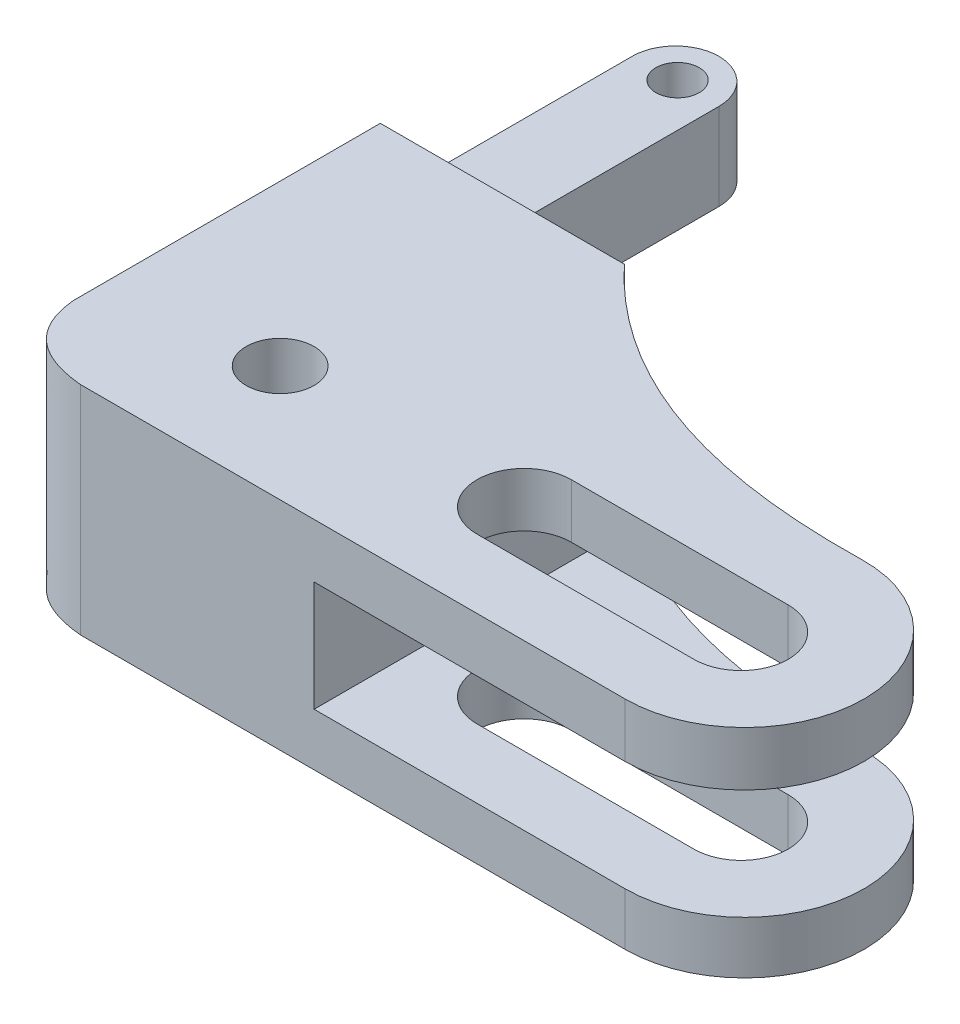
ISO-10303-21;
HEADER;
FILE_DESCRIPTION(('STEP AP214'),'2;1');
FILE_NAME('part.step','',(''),(''),'','','');
FILE_SCHEMA(('AUTOMOTIVE_DESIGN { 1 0 10303 214 1 1 1 1 }'));
ENDSEC;
DATA;
#1=APPLICATION_CONTEXT('core data for automotive mechanical design processes');
#2=APPLICATION_PROTOCOL_DEFINITION('international standard','automotive_design',2000,#1);
#3=PRODUCT_CONTEXT('',#1,'mechanical');
#4=PRODUCT('Part','Part','',(#3));
#5=PRODUCT_RELATED_PRODUCT_CATEGORY('part','',(#4));
#6=PRODUCT_DEFINITION_FORMATION('','',#4);
#7=PRODUCT_DEFINITION_CONTEXT('part definition',#1,'design');
#8=PRODUCT_DEFINITION('design','',#6,#7);
#9=PRODUCT_DEFINITION_SHAPE('','',#8);
#10=(LENGTH_UNIT() NAMED_UNIT(*) SI_UNIT(.MILLI.,.METRE.));
#11=(NAMED_UNIT(*) PLANE_ANGLE_UNIT() SI_UNIT($,.RADIAN.));
#12=(NAMED_UNIT(*) SI_UNIT($,.STERADIAN.) SOLID_ANGLE_UNIT());
#13=UNCERTAINTY_MEASURE_WITH_UNIT(LENGTH_MEASURE(1.E-05),#10,'distance_accuracy_value','');
#14=(GEOMETRIC_REPRESENTATION_CONTEXT(3) GLOBAL_UNCERTAINTY_ASSIGNED_CONTEXT((#13)) GLOBAL_UNIT_ASSIGNED_CONTEXT((#10,
#11,#12)) REPRESENTATION_CONTEXT('',''));
#15=CARTESIAN_POINT('',(0.,0.,0.));
#16=DIRECTION('',(0.,0.,1.));
#17=DIRECTION('',(1.,0.,0.));
#18=AXIS2_PLACEMENT_3D('',#15,#16,#17);
#19=CARTESIAN_POINT('',(-29.,27.4792545285037,-55.));
#20=DIRECTION('',(-1.,0.,0.));
#21=DIRECTION('',(0.,0.,1.));
#22=AXIS2_PLACEMENT_3D('',#19,#20,#21);
#23=PLANE('',#22);
#24=DIRECTION('',(0.,1.,0.));
#25=VECTOR('',#24,1.);
#26=CARTESIAN_POINT('',(-29.,-32.6007454714963,-46.4389445428292));
#27=LINE('',#26,#25);
#28=CARTESIAN_POINT('',(-29.,11.4792545285037,-46.4389445428292));
#29=VERTEX_POINT('',#28);
#30=CARTESIAN_POINT('',(-29.,27.4792545285037,-46.4389445428292));
#31=VERTEX_POINT('',#30);
#32=EDGE_CURVE('E54',#29,#31,#27,.T.);
#33=ORIENTED_EDGE('',*,*,#32,.T.);
#34=DIRECTION('',(0.,0.,1.));
#35=VECTOR('',#34,1.);
#36=CARTESIAN_POINT('',(-29.,27.4792545285037,-55.));
#37=LINE('',#36,#35);
#38=CARTESIAN_POINT('',(-29.,27.4792545285037,0.));
#39=VERTEX_POINT('',#38);
#40=EDGE_CURVE('E196',#31,#39,#37,.T.);
#41=ORIENTED_EDGE('',*,*,#40,.T.);
#42=DIRECTION('',(0.,-1.,0.));
#43=VECTOR('',#42,1.);
#44=CARTESIAN_POINT('',(-29.,27.4792545285037,0.));
#45=LINE('',#44,#43);
#46=CARTESIAN_POINT('',(-29.,11.4792545285037,0.));
#47=VERTEX_POINT('',#46);
#48=EDGE_CURVE('E401',#39,#47,#45,.T.);
#49=ORIENTED_EDGE('',*,*,#48,.T.);
#50=DIRECTION('',(0.,0.,1.));
#51=VECTOR('',#50,1.);
#52=CARTESIAN_POINT('',(-29.,11.4792545285037,-55.));
#53=LINE('',#52,#51);
#54=EDGE_CURVE('E198',#29,#47,#53,.T.);
#55=ORIENTED_EDGE('',*,*,#54,.F.);
#56=EDGE_LOOP('',(#33,#41,#49,#55));
#57=FACE_BOUND('',#56,.T.);
#58=ADVANCED_FACE('F38',(#57),#23,.F.);
#59=CARTESIAN_POINT('',(69.5078731609222,40.,47.3289069751449));
#60=DIRECTION('',(0.,-1.,0.));
#61=DIRECTION('',(0.,0.,-1.));
#62=AXIS2_PLACEMENT_3D('',#59,#60,#61);
#63=CYLINDRICAL_SURFACE('',#62,22.0423984857294);
#64=DIRECTION('',(0.,-1.,0.));
#65=VECTOR('',#64,1.);
#66=CARTESIAN_POINT('',(69.5078731609222,40.,69.3713054608743));
#67=LINE('',#66,#65);
#68=CARTESIAN_POINT('',(69.5078731609222,40.,69.3713054608743));
#69=VERTEX_POINT('',#68);
#70=CARTESIAN_POINT('',(69.5078731609222,30.010232124605,69.3713054608743));
#71=VERTEX_POINT('',#70);
#72=EDGE_CURVE('E336',#69,#71,#67,.T.);
#73=ORIENTED_EDGE('',*,*,#72,.T.);
#74=CARTESIAN_POINT('',(69.5078731609222,30.010232124605,47.3289069751449));
#75=DIRECTION('',(0.,1.,0.));
#76=DIRECTION('',(0.,0.,1.));
#77=AXIS2_PLACEMENT_3D('',#74,#75,#76);
#78=CIRCLE('',#77,22.0423984857294);
#79=CARTESIAN_POINT('',(69.0559863600929,30.010232124605,25.2911409966497));
#80=VERTEX_POINT('',#79);
#81=EDGE_CURVE('E395',#71,#80,#78,.T.);
#82=ORIENTED_EDGE('',*,*,#81,.T.);
#83=DIRECTION('',(0.,-1.,0.));
#84=VECTOR('',#83,1.);
#85=CARTESIAN_POINT('',(69.0559863600929,40.,25.2911409966497));
#86=LINE('',#85,#84);
#87=CARTESIAN_POINT('',(69.0559863600929,40.,25.2911409966497));
#88=VERTEX_POINT('',#87);
#89=EDGE_CURVE('E332',#88,#80,#86,.T.);
#90=ORIENTED_EDGE('',*,*,#89,.F.);
#91=CARTESIAN_POINT('',(69.5078731609222,40.,47.3289069751449));
#92=DIRECTION('',(0.,1.,0.));
#93=DIRECTION('',(0.,0.,-1.));
#94=AXIS2_PLACEMENT_3D('',#91,#92,#93);
#95=CIRCLE('',#94,22.0423984857294);
#96=EDGE_CURVE('E295',#69,#88,#95,.T.);
#97=ORIENTED_EDGE('',*,*,#96,.F.);
#98=EDGE_LOOP('',(#73,#82,#90,#97));
#99=FACE_BOUND('',#98,.T.);
#100=ADVANCED_FACE('F281',(#99),#63,.T.);
#101=CARTESIAN_POINT('',(29.521633996769,40.,48.));
#102=DIRECTION('',(0.,-1.,0.));
#103=DIRECTION('',(0.,0.,-1.));
#104=AXIS2_PLACEMENT_3D('',#101,#102,#103);
#105=CYLINDRICAL_SURFACE('',#104,8.69568045494646);
#106=CARTESIAN_POINT('',(29.521633996769,30.010232124605,48.));
#107=DIRECTION('',(0.,1.,0.));
#108=DIRECTION('',(0.,0.,1.));
#109=AXIS2_PLACEMENT_3D('',#106,#107,#108);
#110=CIRCLE('',#109,8.69568045494646);
#111=CARTESIAN_POINT('',(29.521633996769,30.010232124605,39.3043195450535));
#112=VERTEX_POINT('',#111);
#113=CARTESIAN_POINT('',(29.521633996769,30.010232124605,56.6956804549465));
#114=VERTEX_POINT('',#113);
#115=EDGE_CURVE('E390',#112,#114,#110,.T.);
#116=ORIENTED_EDGE('',*,*,#115,.F.);
#117=DIRECTION('',(0.,-1.,0.));
#118=VECTOR('',#117,1.);
#119=CARTESIAN_POINT('',(29.521633996769,40.,39.3043195450535));
#120=LINE('',#119,#118);
#121=CARTESIAN_POINT('',(29.521633996769,40.,39.3043195450535));
#122=VERTEX_POINT('',#121);
#123=EDGE_CURVE('E239',#122,#112,#120,.T.);
#124=ORIENTED_EDGE('',*,*,#123,.F.);
#125=CARTESIAN_POINT('',(29.521633996769,40.,48.));
#126=DIRECTION('',(0.,1.,0.));
#127=DIRECTION('',(0.,0.,1.));
#128=AXIS2_PLACEMENT_3D('',#125,#126,#127);
#129=CIRCLE('',#128,8.69568045494646);
#130=CARTESIAN_POINT('',(29.521633996769,40.,56.6956804549465));
#131=VERTEX_POINT('',#130);
#132=EDGE_CURVE('E218',#122,#131,#129,.T.);
#133=ORIENTED_EDGE('',*,*,#132,.T.);
#134=DIRECTION('',(0.,-1.,0.));
#135=VECTOR('',#134,1.);
#136=CARTESIAN_POINT('',(29.521633996769,40.,56.6956804549465));
#137=LINE('',#136,#135);
#138=EDGE_CURVE('E251',#131,#114,#137,.T.);
#139=ORIENTED_EDGE('',*,*,#138,.T.);
#140=EDGE_LOOP('',(#116,#124,#133,#139));
#141=FACE_BOUND('',#140,.T.);
#142=ADVANCED_FACE('F434',(#141),#105,.F.);
#143=CARTESIAN_POINT('',(29.521633996769,40.,56.6956804549465));
#144=DIRECTION('',(0.,0.,-1.));
#145=DIRECTION('',(-1.,0.,0.));
#146=AXIS2_PLACEMENT_3D('',#143,#144,#145);
#147=PLANE('',#146);
#148=DIRECTION('',(1.,0.,0.));
#149=VECTOR('',#148,1.);
#150=CARTESIAN_POINT('',(29.521633996769,30.010232124605,56.6956804549465));
#151=LINE('',#150,#149);
#152=CARTESIAN_POINT('',(69.521633996769,30.010232124605,56.6956804549465));
#153=VERTEX_POINT('',#152);
#154=EDGE_CURVE('E388',#114,#153,#151,.T.);
#155=ORIENTED_EDGE('',*,*,#154,.F.);
#156=ORIENTED_EDGE('',*,*,#138,.F.);
#157=DIRECTION('',(1.,0.,0.));
#158=VECTOR('',#157,1.);
#159=CARTESIAN_POINT('',(29.521633996769,40.,56.6956804549465));
#160=LINE('',#159,#158);
#161=CARTESIAN_POINT('',(69.521633996769,40.,56.6956804549465));
#162=VERTEX_POINT('',#161);
#163=EDGE_CURVE('E220',#131,#162,#160,.T.);
#164=ORIENTED_EDGE('',*,*,#163,.T.);
#165=DIRECTION('',(0.,-1.,0.));
#166=VECTOR('',#165,1.);
#167=CARTESIAN_POINT('',(69.521633996769,40.,56.6956804549465));
#168=LINE('',#167,#166);
#169=EDGE_CURVE('E247',#162,#153,#168,.T.);
#170=ORIENTED_EDGE('',*,*,#169,.T.);
#171=EDGE_LOOP('',(#155,#156,#164,#170));
#172=FACE_BOUND('',#171,.T.);
#173=ADVANCED_FACE('F454',(#172),#147,.T.);
#174=CARTESIAN_POINT('',(69.521633996769,40.,48.));
#175=DIRECTION('',(0.,-1.,0.));
#176=DIRECTION('',(0.,0.,-1.));
#177=AXIS2_PLACEMENT_3D('',#174,#175,#176);
#178=CYLINDRICAL_SURFACE('',#177,8.69568045494646);
#179=CARTESIAN_POINT('',(69.521633996769,30.010232124605,48.));
#180=DIRECTION('',(0.,1.,0.));
#181=DIRECTION('',(0.,0.,1.));
#182=AXIS2_PLACEMENT_3D('',#179,#180,#181);
#183=CIRCLE('',#182,8.69568045494646);
#184=CARTESIAN_POINT('',(69.521633996769,30.010232124605,39.3043195450535));
#185=VERTEX_POINT('',#184);
#186=EDGE_CURVE('E386',#153,#185,#183,.T.);
#187=ORIENTED_EDGE('',*,*,#186,.F.);
#188=ORIENTED_EDGE('',*,*,#169,.F.);
#189=CARTESIAN_POINT('',(69.521633996769,40.,48.));
#190=DIRECTION('',(0.,1.,0.));
#191=DIRECTION('',(0.,0.,1.));
#192=AXIS2_PLACEMENT_3D('',#189,#190,#191);
#193=CIRCLE('',#192,8.69568045494646);
#194=CARTESIAN_POINT('',(69.521633996769,40.,39.3043195450535));
#195=VERTEX_POINT('',#194);
#196=EDGE_CURVE('E223',#162,#195,#193,.T.);
#197=ORIENTED_EDGE('',*,*,#196,.T.);
#198=DIRECTION('',(0.,-1.,0.));
#199=VECTOR('',#198,1.);
#200=CARTESIAN_POINT('',(69.521633996769,40.,39.3043195450535));
#201=LINE('',#200,#199);
#202=EDGE_CURVE('E243',#195,#185,#201,.T.);
#203=ORIENTED_EDGE('',*,*,#202,.T.);
#204=EDGE_LOOP('',(#187,#188,#197,#203));
#205=FACE_BOUND('',#204,.T.);
#206=ADVANCED_FACE('F450',(#205),#178,.F.);
#207=CARTESIAN_POINT('',(29.521633996769,40.,39.3043195450535));
#208=DIRECTION('',(0.,0.,1.));
#209=DIRECTION('',(1.,0.,0.));
#210=AXIS2_PLACEMENT_3D('',#207,#208,#209);
#211=PLANE('',#210);
#212=DIRECTION('',(-1.,0.,0.));
#213=VECTOR('',#212,1.);
#214=CARTESIAN_POINT('',(29.521633996769,30.010232124605,39.3043195450535));
#215=LINE('',#214,#213);
#216=EDGE_CURVE('E347',#185,#112,#215,.T.);
#217=ORIENTED_EDGE('',*,*,#216,.F.);
#218=ORIENTED_EDGE('',*,*,#202,.F.);
#219=DIRECTION('',(-1.,0.,0.));
#220=VECTOR('',#219,1.);
#221=CARTESIAN_POINT('',(29.521633996769,40.,39.3043195450535));
#222=LINE('',#221,#220);
#223=EDGE_CURVE('E226',#195,#122,#222,.T.);
#224=ORIENTED_EDGE('',*,*,#223,.T.);
#225=ORIENTED_EDGE('',*,*,#123,.T.);
#226=EDGE_LOOP('',(#217,#218,#224,#225));
#227=FACE_BOUND('',#226,.T.);
#228=ADVANCED_FACE('F445',(#227),#211,.T.);
#229=CARTESIAN_POINT('',(-45.,40.,0.));
#230=DIRECTION('',(0.,0.,1.));
#231=DIRECTION('',(1.,0.,0.));
#232=AXIS2_PLACEMENT_3D('',#229,#230,#231);
#233=PLANE('',#232);
#234=DIRECTION('',(1.,0.,0.));
#235=VECTOR('',#234,1.);
#236=CARTESIAN_POINT('',(-45.,27.4792545285037,0.));
#237=LINE('',#236,#235);
#238=CARTESIAN_POINT('',(-45.,27.4792545285037,0.));
#239=VERTEX_POINT('',#238);
#240=EDGE_CURVE('E203',#239,#39,#237,.T.);
#241=ORIENTED_EDGE('',*,*,#240,.F.);
#242=DIRECTION('',(0.,-1.,0.));
#243=VECTOR('',#242,1.);
#244=CARTESIAN_POINT('',(-45.,40.,0.));
#245=LINE('',#244,#243);
#246=CARTESIAN_POINT('',(-45.,40.,0.));
#247=VERTEX_POINT('',#246);
#248=EDGE_CURVE('E325',#247,#239,#245,.T.);
#249=ORIENTED_EDGE('',*,*,#248,.F.);
#250=DIRECTION('',(-1.,0.,0.));
#251=VECTOR('',#250,1.);
#252=CARTESIAN_POINT('',(-45.,40.,0.));
#253=LINE('',#252,#251);
#254=CARTESIAN_POINT('',(0.,40.,0.));
#255=VERTEX_POINT('',#254);
#256=EDGE_CURVE('E294',#255,#247,#253,.T.);
#257=ORIENTED_EDGE('',*,*,#256,.F.);
#258=DIRECTION('',(0.,-1.,0.));
#259=VECTOR('',#258,1.);
#260=CARTESIAN_POINT('',(0.,40.,0.));
#261=LINE('',#260,#259);
#262=CARTESIAN_POINT('',(0.,0.,0.));
#263=VERTEX_POINT('',#262);
#264=EDGE_CURVE('E328',#255,#263,#261,.T.);
#265=ORIENTED_EDGE('',*,*,#264,.T.);
#266=DIRECTION('',(-1.,0.,0.));
#267=VECTOR('',#266,1.);
#268=CARTESIAN_POINT('',(-45.,0.,0.));
#269=LINE('',#268,#267);
#270=CARTESIAN_POINT('',(-45.,0.,0.));
#271=VERTEX_POINT('',#270);
#272=EDGE_CURVE('E258',#263,#271,#269,.T.);
#273=ORIENTED_EDGE('',*,*,#272,.T.);
#274=CARTESIAN_POINT('',(-45.,11.4792545285037,0.));
#275=VERTEX_POINT('',#274);
#276=EDGE_CURVE('E300',#275,#271,#245,.T.);
#277=ORIENTED_EDGE('',*,*,#276,.F.);
#278=DIRECTION('',(-1.,0.,0.));
#279=VECTOR('',#278,1.);
#280=CARTESIAN_POINT('',(-29.,11.4792545285037,0.));
#281=LINE('',#280,#279);
#282=EDGE_CURVE('E403',#47,#275,#281,.T.);
#283=ORIENTED_EDGE('',*,*,#282,.F.);
#284=ORIENTED_EDGE('',*,*,#48,.F.);
#285=EDGE_LOOP('',(#241,#249,#257,#265,#273,#277,#283,#284));
#286=FACE_BOUND('',#285,.T.);
#287=ADVANCED_FACE('F287',(#286),#233,.F.);
#288=CARTESIAN_POINT('',(-40.9290697802702,40.,65.6332777297204));
#289=DIRECTION('',(0.,-1.,0.));
#290=DIRECTION('',(0.,0.,-1.));
#291=AXIS2_PLACEMENT_3D('',#288,#289,#290);
#292=PLANE('',#291);
#293=DIRECTION('',(0.,0.,1.));
#294=VECTOR('',#293,1.);
#295=CARTESIAN_POINT('',(-45.,40.,0.));
#296=LINE('',#295,#294);
#297=CARTESIAN_POINT('',(-45.,40.,56.6956804549465));
#298=VERTEX_POINT('',#297);
#299=EDGE_CURVE('E255',#247,#298,#296,.T.);
#300=ORIENTED_EDGE('',*,*,#299,.T.);
#301=CARTESIAN_POINT('',(-45.,40.,56.6956804549465));
#302=CARTESIAN_POINT('',(-43.8987593024814,40.,68.2330625015305));
#303=CARTESIAN_POINT('',(-30.918760516118,40.,69.3713054608743));
#304=B_SPLINE_CURVE_WITH_KNOTS('',2,(#301,#302,#303),.UNSPECIFIED.,.F.,.F.,(3,3),(0.,1.),.UNSPECIFIED.);
#305=CARTESIAN_POINT('',(-30.918760516118,40.,69.3713054608743));
#306=VERTEX_POINT('',#305);
#307=EDGE_CURVE('E257',#298,#306,#304,.T.);
#308=ORIENTED_EDGE('',*,*,#307,.T.);
#309=DIRECTION('',(1.,0.,0.));
#310=VECTOR('',#309,1.);
#311=CARTESIAN_POINT('',(-30.918760516118,40.,69.3713054608743));
#312=LINE('',#311,#310);
#313=EDGE_CURVE('E263',#306,#69,#312,.T.);
#314=ORIENTED_EDGE('',*,*,#313,.T.);
#315=ORIENTED_EDGE('',*,*,#96,.T.);
#316=CARTESIAN_POINT('',(69.0559863600929,40.,25.2911409966497));
#317=CARTESIAN_POINT('',(40.5073263394192,40.,25.8765343916652));
#318=CARTESIAN_POINT('',(17.3659830879704,40.,18.5560622347472));
#319=CARTESIAN_POINT('',(0.,40.,0.));
#320=B_SPLINE_CURVE_WITH_KNOTS('',3,(#316,#317,#318,#319),.UNSPECIFIED.,.F.,.F.,(4,4),(0.,1.),.UNSPECIFIED.);
#321=EDGE_CURVE('E289',#88,#255,#320,.T.);
#322=ORIENTED_EDGE('',*,*,#321,.T.);
#323=ORIENTED_EDGE('',*,*,#256,.T.);
#324=EDGE_LOOP('',(#300,#308,#314,#315,#322,#323));
#325=FACE_BOUND('',#324,.T.);
#326=ORIENTED_EDGE('',*,*,#132,.F.);
#327=ORIENTED_EDGE('',*,*,#223,.F.);
#328=ORIENTED_EDGE('',*,*,#196,.F.);
#329=ORIENTED_EDGE('',*,*,#163,.F.);
#330=EDGE_LOOP('',(#326,#327,#328,#329));
#331=FACE_BOUND('',#330,.T.);
#332=CARTESIAN_POINT('',(-15.478366003231,40.,48.));
#333=DIRECTION('',(0.,1.,0.));
#334=DIRECTION('',(0.,0.,1.));
#335=AXIS2_PLACEMENT_3D('',#332,#333,#334);
#336=CIRCLE('',#335,6.25);
#337=CARTESIAN_POINT('',(-15.478366003231,40.,54.25));
#338=VERTEX_POINT('',#337);
#339=EDGE_CURVE('E212',#338,#338,#336,.T.);
#340=ORIENTED_EDGE('',*,*,#339,.F.);
#341=EDGE_LOOP('',(#340));
#342=FACE_BOUND('',#341,.T.);
#343=ADVANCED_FACE('F458',(#325,#331,#342),#292,.F.);
#344=CARTESIAN_POINT('',(-40.9290697802702,0.,65.6332777297204));
#345=DIRECTION('',(0.,-1.,0.));
#346=DIRECTION('',(0.,0.,-1.));
#347=AXIS2_PLACEMENT_3D('',#344,#345,#346);
#348=PLANE('',#347);
#349=DIRECTION('',(-1.,0.,0.));
#350=VECTOR('',#349,1.);
#351=CARTESIAN_POINT('',(29.521633996769,0.,39.3043195450535));
#352=LINE('',#351,#350);
#353=CARTESIAN_POINT('',(69.521633996769,0.,39.3043195450535));
#354=VERTEX_POINT('',#353);
#355=CARTESIAN_POINT('',(29.521633996769,0.,39.3043195450535));
#356=VERTEX_POINT('',#355);
#357=EDGE_CURVE('E221',#354,#356,#352,.T.);
#358=ORIENTED_EDGE('',*,*,#357,.T.);
#359=CARTESIAN_POINT('',(29.521633996769,0.,48.));
#360=DIRECTION('',(0.,1.,0.));
#361=DIRECTION('',(0.,0.,1.));
#362=AXIS2_PLACEMENT_3D('',#359,#360,#361);
#363=CIRCLE('',#362,8.69568045494646);
#364=CARTESIAN_POINT('',(29.521633996769,0.,56.6956804549465));
#365=VERTEX_POINT('',#364);
#366=EDGE_CURVE('E215',#356,#365,#363,.T.);
#367=ORIENTED_EDGE('',*,*,#366,.T.);
#368=DIRECTION('',(1.,0.,0.));
#369=VECTOR('',#368,1.);
#370=CARTESIAN_POINT('',(29.521633996769,0.,56.6956804549465));
#371=LINE('',#370,#369);
#372=CARTESIAN_POINT('',(69.521633996769,0.,56.6956804549465));
#373=VERTEX_POINT('',#372);
#374=EDGE_CURVE('E231',#365,#373,#371,.T.);
#375=ORIENTED_EDGE('',*,*,#374,.T.);
#376=CARTESIAN_POINT('',(69.521633996769,0.,48.));
#377=DIRECTION('',(0.,1.,0.));
#378=DIRECTION('',(0.,0.,1.));
#379=AXIS2_PLACEMENT_3D('',#376,#377,#378);
#380=CIRCLE('',#379,8.69568045494646);
#381=EDGE_CURVE('E234',#373,#354,#380,.T.);
#382=ORIENTED_EDGE('',*,*,#381,.T.);
#383=EDGE_LOOP('',(#358,#367,#375,#382));
#384=FACE_BOUND('',#383,.T.);
#385=DIRECTION('',(0.,0.,1.));
#386=VECTOR('',#385,1.);
#387=CARTESIAN_POINT('',(-45.,0.,56.6956804549465));
#388=LINE('',#387,#386);
#389=CARTESIAN_POINT('',(-45.,0.,56.6956804549465));
#390=VERTEX_POINT('',#389);
#391=EDGE_CURVE('E254',#271,#390,#388,.T.);
#392=ORIENTED_EDGE('',*,*,#391,.F.);
#393=ORIENTED_EDGE('',*,*,#272,.F.);
#394=CARTESIAN_POINT('',(69.0559863600929,0.,25.2911409966497));
#395=CARTESIAN_POINT('',(40.5073263394192,0.,25.8765343916652));
#396=CARTESIAN_POINT('',(17.3659830879704,0.,18.5560622347472));
#397=CARTESIAN_POINT('',(0.,0.,0.));
#398=B_SPLINE_CURVE_WITH_KNOTS('',3,(#394,#395,#396,#397),.UNSPECIFIED.,.F.,.F.,(4,4),(0.,1.),.UNSPECIFIED.);
#399=CARTESIAN_POINT('',(69.0559863600929,0.,25.2911409966497));
#400=VERTEX_POINT('',#399);
#401=EDGE_CURVE('E316',#400,#263,#398,.T.);
#402=ORIENTED_EDGE('',*,*,#401,.F.);
#403=CARTESIAN_POINT('',(69.5078731609222,0.,47.3289069751449));
#404=DIRECTION('',(0.,1.,0.));
#405=DIRECTION('',(0.,0.,-1.));
#406=AXIS2_PLACEMENT_3D('',#403,#404,#405);
#407=CIRCLE('',#406,22.0423984857294);
#408=CARTESIAN_POINT('',(69.5078731609222,0.,69.3713054608743));
#409=VERTEX_POINT('',#408);
#410=EDGE_CURVE('E313',#409,#400,#407,.T.);
#411=ORIENTED_EDGE('',*,*,#410,.F.);
#412=DIRECTION('',(1.,0.,0.));
#413=VECTOR('',#412,1.);
#414=CARTESIAN_POINT('',(69.5078731609222,0.,69.3713054608743));
#415=LINE('',#414,#413);
#416=CARTESIAN_POINT('',(-30.918760516118,0.,69.3713054608743));
#417=VERTEX_POINT('',#416);
#418=EDGE_CURVE('E307',#417,#409,#415,.T.);
#419=ORIENTED_EDGE('',*,*,#418,.F.);
#420=CARTESIAN_POINT('',(-45.,0.,56.6956804549465));
#421=CARTESIAN_POINT('',(-43.8987593024814,0.,68.2330625015305));
#422=CARTESIAN_POINT('',(-30.918760516118,0.,69.3713054608743));
#423=B_SPLINE_CURVE_WITH_KNOTS('',2,(#420,#421,#422),.UNSPECIFIED.,.F.,.F.,(3,3),(0.,1.),.UNSPECIFIED.);
#424=EDGE_CURVE('E302',#390,#417,#423,.T.);
#425=ORIENTED_EDGE('',*,*,#424,.F.);
#426=EDGE_LOOP('',(#392,#393,#402,#411,#419,#425));
#427=FACE_BOUND('',#426,.T.);
#428=CARTESIAN_POINT('',(-15.478366003231,0.,48.));
#429=DIRECTION('',(0.,1.,0.));
#430=DIRECTION('',(0.,0.,1.));
#431=AXIS2_PLACEMENT_3D('',#428,#429,#430);
#432=CIRCLE('',#431,6.25);
#433=CARTESIAN_POINT('',(-15.478366003231,0.,54.25));
#434=VERTEX_POINT('',#433);
#435=EDGE_CURVE('E206',#434,#434,#432,.T.);
#436=ORIENTED_EDGE('',*,*,#435,.T.);
#437=EDGE_LOOP('',(#436));
#438=FACE_BOUND('',#437,.T.);
#439=ADVANCED_FACE('F460',(#384,#427,#438),#348,.T.);
#440=CARTESIAN_POINT('',(-45.,40.,56.6956804549465));
#441=DIRECTION('',(1.,0.,0.));
#442=DIRECTION('',(0.,0.,-1.));
#443=AXIS2_PLACEMENT_3D('',#440,#441,#442);
#444=PLANE('',#443);
#445=DIRECTION('',(0.,0.,1.));
#446=VECTOR('',#445,1.);
#447=CARTESIAN_POINT('',(-45.,27.4792545285037,-55.));
#448=LINE('',#447,#446);
#449=CARTESIAN_POINT('',(-45.,27.4792545285037,-46.4389445428292));
#450=VERTEX_POINT('',#449);
#451=EDGE_CURVE('E204',#450,#239,#448,.T.);
#452=ORIENTED_EDGE('',*,*,#451,.F.);
#453=DIRECTION('',(0.,1.,0.));
#454=VECTOR('',#453,1.);
#455=CARTESIAN_POINT('',(-45.,-32.6007454714963,-46.4389445428292));
#456=LINE('',#455,#454);
#457=CARTESIAN_POINT('',(-45.,11.4792545285037,-46.4389445428292));
#458=VERTEX_POINT('',#457);
#459=EDGE_CURVE('E188',#458,#450,#456,.T.);
#460=ORIENTED_EDGE('',*,*,#459,.F.);
#461=DIRECTION('',(0.,0.,1.));
#462=VECTOR('',#461,1.);
#463=CARTESIAN_POINT('',(-45.,11.4792545285037,-55.));
#464=LINE('',#463,#462);
#465=EDGE_CURVE('E208',#458,#275,#464,.T.);
#466=ORIENTED_EDGE('',*,*,#465,.T.);
#467=ORIENTED_EDGE('',*,*,#276,.T.);
#468=ORIENTED_EDGE('',*,*,#391,.T.);
#469=DIRECTION('',(0.,-1.,0.));
#470=VECTOR('',#469,1.);
#471=CARTESIAN_POINT('',(-45.,40.,56.6956804549465));
#472=LINE('',#471,#470);
#473=EDGE_CURVE('E342',#298,#390,#472,.T.);
#474=ORIENTED_EDGE('',*,*,#473,.F.);
#475=ORIENTED_EDGE('',*,*,#299,.F.);
#476=ORIENTED_EDGE('',*,*,#248,.T.);
#477=EDGE_LOOP('',(#452,#460,#466,#467,#468,#474,#475,#476));
#478=FACE_BOUND('',#477,.T.);
#479=ADVANCED_FACE('F40',(#478),#444,.F.);
#480=DIRECTION('',(0.,-1.,0.));
#481=VECTOR('',#480,1.);
#482=SURFACE_OF_LINEAR_EXTRUSION('',#304,#481);
#483=ORIENTED_EDGE('',*,*,#424,.T.);
#484=DIRECTION('',(0.,-1.,0.));
#485=VECTOR('',#484,1.);
#486=CARTESIAN_POINT('',(-30.918760516118,40.,69.3713054608743));
#487=LINE('',#486,#485);
#488=EDGE_CURVE('E339',#306,#417,#487,.T.);
#489=ORIENTED_EDGE('',*,*,#488,.F.);
#490=ORIENTED_EDGE('',*,*,#307,.F.);
#491=ORIENTED_EDGE('',*,*,#473,.T.);
#492=EDGE_LOOP('',(#483,#489,#490,#491));
#493=FACE_BOUND('',#492,.T.);
#494=ADVANCED_FACE('F268',(#493),#482,.F.);
#495=CARTESIAN_POINT('',(69.5078731609222,40.,69.3713054608743));
#496=DIRECTION('',(0.,0.,-1.));
#497=DIRECTION('',(-1.,0.,0.));
#498=AXIS2_PLACEMENT_3D('',#495,#496,#497);
#499=PLANE('',#498);
#500=DIRECTION('',(0.,-1.,0.));
#501=VECTOR('',#500,1.);
#502=CARTESIAN_POINT('',(12.1677941120817,30.010232124605,69.3713054608743));
#503=LINE('',#502,#501);
#504=CARTESIAN_POINT('',(12.1677941120817,30.010232124605,69.3713054608743));
#505=VERTEX_POINT('',#504);
#506=CARTESIAN_POINT('',(12.1677941120817,9.68837667406763,69.3713054608743));
#507=VERTEX_POINT('',#506);
#508=EDGE_CURVE('E489',#505,#507,#503,.T.);
#509=ORIENTED_EDGE('',*,*,#508,.F.);
#510=DIRECTION('',(-1.,0.,0.));
#511=VECTOR('',#510,1.);
#512=CARTESIAN_POINT('',(12.1677941120817,30.010232124605,69.3713054608743));
#513=LINE('',#512,#511);
#514=EDGE_CURVE('E366',#71,#505,#513,.T.);
#515=ORIENTED_EDGE('',*,*,#514,.F.);
#516=ORIENTED_EDGE('',*,*,#72,.F.);
#517=ORIENTED_EDGE('',*,*,#313,.F.);
#518=ORIENTED_EDGE('',*,*,#488,.T.);
#519=ORIENTED_EDGE('',*,*,#418,.T.);
#520=CARTESIAN_POINT('',(69.5078731609222,9.68837667406763,69.3713054608743));
#521=VERTEX_POINT('',#520);
#522=EDGE_CURVE('E335',#521,#409,#67,.T.);
#523=ORIENTED_EDGE('',*,*,#522,.F.);
#524=DIRECTION('',(1.,0.,0.));
#525=VECTOR('',#524,1.);
#526=CARTESIAN_POINT('',(12.1677941120817,9.68837667406763,69.3713054608743));
#527=LINE('',#526,#525);
#528=EDGE_CURVE('E490',#507,#521,#527,.T.);
#529=ORIENTED_EDGE('',*,*,#528,.F.);
#530=EDGE_LOOP('',(#509,#515,#516,#517,#518,#519,#523,#529));
#531=FACE_BOUND('',#530,.T.);
#532=ADVANCED_FACE('F271',(#531),#499,.F.);
#533=CARTESIAN_POINT('',(69.0559863600929,9.68837667406763,25.2911409966497));
#534=VERTEX_POINT('',#533);
#535=EDGE_CURVE('E331',#534,#400,#86,.T.);
#536=ORIENTED_EDGE('',*,*,#535,.F.);
#537=CARTESIAN_POINT('',(69.5078731609222,9.68837667406763,47.3289069751449));
#538=DIRECTION('',(0.,-1.,0.));
#539=DIRECTION('',(0.,0.,-1.));
#540=AXIS2_PLACEMENT_3D('',#537,#538,#539);
#541=CIRCLE('',#540,22.0423984857294);
#542=EDGE_CURVE('E61',#534,#521,#541,.T.);
#543=ORIENTED_EDGE('',*,*,#542,.T.);
#544=ORIENTED_EDGE('',*,*,#522,.T.);
#545=ORIENTED_EDGE('',*,*,#410,.T.);
#546=EDGE_LOOP('',(#536,#543,#544,#545));
#547=FACE_BOUND('',#546,.T.);
#548=ADVANCED_FACE('F275',(#547),#63,.T.);
#549=DIRECTION('',(0.,-1.,0.));
#550=VECTOR('',#549,1.);
#551=SURFACE_OF_LINEAR_EXTRUSION('',#320,#550);
#552=ORIENTED_EDGE('',*,*,#89,.T.);
#553=CARTESIAN_POINT('',(69.0559863600929,30.010232124605,25.2911409966497));
#554=CARTESIAN_POINT('',(40.5073263394192,30.010232124605,25.8765343916652));
#555=CARTESIAN_POINT('',(17.3659830879704,30.010232124605,18.5560622347472));
#556=CARTESIAN_POINT('',(0.,30.010232124605,0.));
#557=B_SPLINE_CURVE_WITH_KNOTS('',3,(#553,#554,#555,#556),.UNSPECIFIED.,.F.,.F.,(4,4),(0.,1.),.UNSPECIFIED.);
#558=CARTESIAN_POINT('',(12.1677941120817,30.010232124605,10.5619164332128));
#559=VERTEX_POINT('',#558);
#560=EDGE_CURVE('E353',#80,#559,#557,.T.);
#561=ORIENTED_EDGE('',*,*,#560,.T.);
#562=DIRECTION('',(0.,-1.,0.));
#563=VECTOR('',#562,1.);
#564=CARTESIAN_POINT('',(12.1677941120817,40.,10.561916438141));
#565=LINE('',#564,#563);
#566=CARTESIAN_POINT('',(12.1677941120817,9.68837667406763,10.5619164332128));
#567=VERTEX_POINT('',#566);
#568=EDGE_CURVE('E47',#559,#567,#565,.T.);
#569=ORIENTED_EDGE('',*,*,#568,.T.);
#570=CARTESIAN_POINT('',(69.0559863600929,9.68837667406763,25.2911409966497));
#571=CARTESIAN_POINT('',(40.5073263394192,9.68837667406763,25.8765343916652));
#572=CARTESIAN_POINT('',(17.3659830879704,9.68837667406763,18.5560622347472));
#573=CARTESIAN_POINT('',(0.,9.68837667406763,0.));
#574=B_SPLINE_CURVE_WITH_KNOTS('',3,(#570,#571,#572,#573),.UNSPECIFIED.,.F.,.F.,(4,4),(0.,1.),.UNSPECIFIED.);
#575=EDGE_CURVE('E351',#567,#534,#574,.F.);
#576=ORIENTED_EDGE('',*,*,#575,.T.);
#577=ORIENTED_EDGE('',*,*,#535,.T.);
#578=ORIENTED_EDGE('',*,*,#401,.T.);
#579=ORIENTED_EDGE('',*,*,#264,.F.);
#580=ORIENTED_EDGE('',*,*,#321,.F.);
#581=EDGE_LOOP('',(#552,#561,#569,#576,#577,#578,#579,#580));
#582=FACE_BOUND('',#581,.T.);
#583=ADVANCED_FACE('F279',(#582),#551,.F.);
#584=CARTESIAN_POINT('',(29.521633996769,9.68837667406763,48.));
#585=DIRECTION('',(0.,-1.,0.));
#586=DIRECTION('',(0.,0.,-1.));
#587=AXIS2_PLACEMENT_3D('',#584,#585,#586);
#588=CIRCLE('',#587,8.69568045494646);
#589=CARTESIAN_POINT('',(29.521633996769,9.68837667406763,56.6956804549465));
#590=VERTEX_POINT('',#589);
#591=CARTESIAN_POINT('',(29.521633996769,9.68837667406763,39.3043195450535));
#592=VERTEX_POINT('',#591);
#593=EDGE_CURVE('E377',#590,#592,#588,.T.);
#594=ORIENTED_EDGE('',*,*,#593,.F.);
#595=EDGE_CURVE('E250',#590,#365,#137,.T.);
#596=ORIENTED_EDGE('',*,*,#595,.T.);
#597=ORIENTED_EDGE('',*,*,#366,.F.);
#598=EDGE_CURVE('E228',#592,#356,#120,.T.);
#599=ORIENTED_EDGE('',*,*,#598,.F.);
#600=EDGE_LOOP('',(#594,#596,#597,#599));
#601=FACE_BOUND('',#600,.T.);
#602=ADVANCED_FACE('F285',(#601),#105,.F.);
#603=DIRECTION('',(-1.,0.,0.));
#604=VECTOR('',#603,1.);
#605=CARTESIAN_POINT('',(29.521633996769,9.68837667406763,56.6956804549465));
#606=LINE('',#605,#604);
#607=CARTESIAN_POINT('',(69.521633996769,9.68837667406763,56.6956804549465));
#608=VERTEX_POINT('',#607);
#609=EDGE_CURVE('E370',#608,#590,#606,.T.);
#610=ORIENTED_EDGE('',*,*,#609,.F.);
#611=EDGE_CURVE('E246',#608,#373,#168,.T.);
#612=ORIENTED_EDGE('',*,*,#611,.T.);
#613=ORIENTED_EDGE('',*,*,#374,.F.);
#614=ORIENTED_EDGE('',*,*,#595,.F.);
#615=EDGE_LOOP('',(#610,#612,#613,#614));
#616=FACE_BOUND('',#615,.T.);
#617=ADVANCED_FACE('F448',(#616),#147,.T.);
#618=CARTESIAN_POINT('',(69.521633996769,9.68837667406763,48.));
#619=DIRECTION('',(0.,-1.,0.));
#620=DIRECTION('',(0.,0.,-1.));
#621=AXIS2_PLACEMENT_3D('',#618,#619,#620);
#622=CIRCLE('',#621,8.69568045494646);
#623=CARTESIAN_POINT('',(69.521633996769,9.68837667406763,39.3043195450535));
#624=VERTEX_POINT('',#623);
#625=EDGE_CURVE('E368',#624,#608,#622,.T.);
#626=ORIENTED_EDGE('',*,*,#625,.F.);
#627=EDGE_CURVE('E242',#624,#354,#201,.T.);
#628=ORIENTED_EDGE('',*,*,#627,.T.);
#629=ORIENTED_EDGE('',*,*,#381,.F.);
#630=ORIENTED_EDGE('',*,*,#611,.F.);
#631=EDGE_LOOP('',(#626,#628,#629,#630));
#632=FACE_BOUND('',#631,.T.);
#633=ADVANCED_FACE('F443',(#632),#178,.F.);
#634=DIRECTION('',(1.,0.,0.));
#635=VECTOR('',#634,1.);
#636=CARTESIAN_POINT('',(29.521633996769,9.68837667406763,39.3043195450535));
#637=LINE('',#636,#635);
#638=EDGE_CURVE('E345',#592,#624,#637,.T.);
#639=ORIENTED_EDGE('',*,*,#638,.F.);
#640=ORIENTED_EDGE('',*,*,#598,.T.);
#641=ORIENTED_EDGE('',*,*,#357,.F.);
#642=ORIENTED_EDGE('',*,*,#627,.F.);
#643=EDGE_LOOP('',(#639,#640,#641,#642));
#644=FACE_BOUND('',#643,.T.);
#645=ADVANCED_FACE('F439',(#644),#211,.T.);
#646=CARTESIAN_POINT('',(-15.478366003231,40.,48.));
#647=DIRECTION('',(0.,-1.,0.));
#648=DIRECTION('',(0.,0.,-1.));
#649=AXIS2_PLACEMENT_3D('',#646,#647,#648);
#650=CYLINDRICAL_SURFACE('',#649,6.25);
#651=ORIENTED_EDGE('',*,*,#339,.T.);
#652=EDGE_LOOP('',(#651));
#653=FACE_BOUND('',#652,.T.);
#654=ORIENTED_EDGE('',*,*,#435,.F.);
#655=EDGE_LOOP('',(#654));
#656=FACE_BOUND('',#655,.T.);
#657=ADVANCED_FACE('F423',(#653,#656),#650,.F.);
#658=CARTESIAN_POINT('',(-45.,27.4792545285037,-55.));
#659=DIRECTION('',(0.,-1.,0.));
#660=DIRECTION('',(1.,0.,0.));
#661=AXIS2_PLACEMENT_3D('',#658,#659,#660);
#662=PLANE('',#661);
#663=CARTESIAN_POINT('',(-37.,27.4792545285037,-46.8194807911042));
#664=DIRECTION('',(0.,1.,0.));
#665=DIRECTION('',(-1.,0.,0.));
#666=AXIS2_PLACEMENT_3D('',#663,#664,#665);
#667=CIRCLE('',#666,4.);
#668=CARTESIAN_POINT('',(-41.,27.4792545285037,-46.8194807911042));
#669=VERTEX_POINT('',#668);
#670=EDGE_CURVE('E494',#669,#669,#667,.T.);
#671=ORIENTED_EDGE('',*,*,#670,.F.);
#672=EDGE_LOOP('',(#671));
#673=FACE_BOUND('',#672,.T.);
#674=ORIENTED_EDGE('',*,*,#40,.F.);
#675=CARTESIAN_POINT('',(-37.,27.4792545285037,-46.4389445428292));
#676=DIRECTION('',(0.,-1.,0.));
#677=DIRECTION('',(-1.,0.,0.));
#678=AXIS2_PLACEMENT_3D('',#675,#676,#677);
#679=CIRCLE('',#678,8.);
#680=EDGE_CURVE('E185',#450,#31,#679,.T.);
#681=ORIENTED_EDGE('',*,*,#680,.F.);
#682=ORIENTED_EDGE('',*,*,#451,.T.);
#683=ORIENTED_EDGE('',*,*,#240,.T.);
#684=EDGE_LOOP('',(#674,#681,#682,#683));
#685=FACE_BOUND('',#684,.T.);
#686=ADVANCED_FACE('F201',(#673,#685),#662,.F.);
#687=CARTESIAN_POINT('',(-29.,11.4792545285037,-55.));
#688=DIRECTION('',(0.,1.,0.));
#689=DIRECTION('',(0.,0.,1.));
#690=AXIS2_PLACEMENT_3D('',#687,#688,#689);
#691=PLANE('',#690);
#692=CARTESIAN_POINT('',(-37.,11.4792545285037,-46.8194807911042));
#693=DIRECTION('',(0.,1.,0.));
#694=DIRECTION('',(0.,0.,1.));
#695=AXIS2_PLACEMENT_3D('',#692,#693,#694);
#696=CIRCLE('',#695,4.);
#697=CARTESIAN_POINT('',(-41.,11.4792545285037,-46.8194807911042));
#698=VERTEX_POINT('',#697);
#699=EDGE_CURVE('E42',#698,#698,#696,.T.);
#700=ORIENTED_EDGE('',*,*,#699,.T.);
#701=EDGE_LOOP('',(#700));
#702=FACE_BOUND('',#701,.T.);
#703=ORIENTED_EDGE('',*,*,#465,.F.);
#704=CARTESIAN_POINT('',(-37.,11.4792545285037,-46.4389445428292));
#705=DIRECTION('',(0.,1.,0.));
#706=DIRECTION('',(0.,0.,1.));
#707=AXIS2_PLACEMENT_3D('',#704,#705,#706);
#708=CIRCLE('',#707,8.);
#709=EDGE_CURVE('E11',#458,#29,#708,.F.);
#710=ORIENTED_EDGE('',*,*,#709,.T.);
#711=ORIENTED_EDGE('',*,*,#54,.T.);
#712=ORIENTED_EDGE('',*,*,#282,.T.);
#713=EDGE_LOOP('',(#703,#710,#711,#712));
#714=FACE_BOUND('',#713,.T.);
#715=ADVANCED_FACE('F413',(#702,#714),#691,.F.);
#716=CARTESIAN_POINT('',(12.1677941120817,30.010232124605,9.29130546087425));
#717=DIRECTION('',(-1.,0.,0.));
#718=DIRECTION('',(0.,0.,1.));
#719=AXIS2_PLACEMENT_3D('',#716,#717,#718);
#720=PLANE('',#719);
#721=DIRECTION('',(0.,0.,1.));
#722=VECTOR('',#721,1.);
#723=CARTESIAN_POINT('',(12.1677941120817,30.010232124605,9.29130546087425));
#724=LINE('',#723,#722);
#725=EDGE_CURVE('E359',#559,#505,#724,.T.);
#726=ORIENTED_EDGE('',*,*,#725,.T.);
#727=ORIENTED_EDGE('',*,*,#508,.T.);
#728=DIRECTION('',(0.,0.,1.));
#729=VECTOR('',#728,1.);
#730=CARTESIAN_POINT('',(12.1677941120817,9.68837667406763,9.29130546087425));
#731=LINE('',#730,#729);
#732=EDGE_CURVE('E361',#567,#507,#731,.T.);
#733=ORIENTED_EDGE('',*,*,#732,.F.);
#734=ORIENTED_EDGE('',*,*,#568,.F.);
#735=EDGE_LOOP('',(#726,#727,#733,#734));
#736=FACE_BOUND('',#735,.T.);
#737=ADVANCED_FACE('F357',(#736),#720,.F.);
#738=CARTESIAN_POINT('',(12.1677941120817,30.010232124605,9.29130546087425));
#739=DIRECTION('',(0.,1.,0.));
#740=DIRECTION('',(0.,0.,1.));
#741=AXIS2_PLACEMENT_3D('',#738,#739,#740);
#742=PLANE('',#741);
#743=ORIENTED_EDGE('',*,*,#115,.T.);
#744=ORIENTED_EDGE('',*,*,#154,.T.);
#745=ORIENTED_EDGE('',*,*,#186,.T.);
#746=ORIENTED_EDGE('',*,*,#216,.T.);
#747=EDGE_LOOP('',(#743,#744,#745,#746));
#748=FACE_BOUND('',#747,.T.);
#749=ORIENTED_EDGE('',*,*,#514,.T.);
#750=ORIENTED_EDGE('',*,*,#725,.F.);
#751=ORIENTED_EDGE('',*,*,#560,.F.);
#752=ORIENTED_EDGE('',*,*,#81,.F.);
#753=EDGE_LOOP('',(#749,#750,#751,#752));
#754=FACE_BOUND('',#753,.T.);
#755=ADVANCED_FACE('F363',(#748,#754),#742,.F.);
#756=CARTESIAN_POINT('',(12.1677941120817,9.68837667406763,9.29130546087425));
#757=DIRECTION('',(0.,-1.,0.));
#758=DIRECTION('',(0.,0.,-1.));
#759=AXIS2_PLACEMENT_3D('',#756,#757,#758);
#760=PLANE('',#759);
#761=ORIENTED_EDGE('',*,*,#593,.T.);
#762=ORIENTED_EDGE('',*,*,#638,.T.);
#763=ORIENTED_EDGE('',*,*,#625,.T.);
#764=ORIENTED_EDGE('',*,*,#609,.T.);
#765=EDGE_LOOP('',(#761,#762,#763,#764));
#766=FACE_BOUND('',#765,.T.);
#767=ORIENTED_EDGE('',*,*,#575,.F.);
#768=ORIENTED_EDGE('',*,*,#732,.T.);
#769=ORIENTED_EDGE('',*,*,#528,.T.);
#770=ORIENTED_EDGE('',*,*,#542,.F.);
#771=EDGE_LOOP('',(#767,#768,#769,#770));
#772=FACE_BOUND('',#771,.T.);
#773=ADVANCED_FACE('F505',(#766,#772),#760,.F.);
#774=CARTESIAN_POINT('',(-37.,-32.6007454714963,-46.4389445428292));
#775=DIRECTION('',(0.,1.,0.));
#776=DIRECTION('',(-1.,0.,0.));
#777=AXIS2_PLACEMENT_3D('',#774,#775,#776);
#778=CYLINDRICAL_SURFACE('',#777,8.);
#779=ORIENTED_EDGE('',*,*,#459,.T.);
#780=ORIENTED_EDGE('',*,*,#680,.T.);
#781=ORIENTED_EDGE('',*,*,#32,.F.);
#782=ORIENTED_EDGE('',*,*,#709,.F.);
#783=EDGE_LOOP('',(#779,#780,#781,#782));
#784=FACE_BOUND('',#783,.T.);
#785=ADVANCED_FACE('F186',(#784),#778,.T.);
#786=CARTESIAN_POINT('',(-37.,-32.6007454714963,-46.8194807911042));
#787=DIRECTION('',(0.,1.,0.));
#788=DIRECTION('',(-1.,0.,0.));
#789=AXIS2_PLACEMENT_3D('',#786,#787,#788);
#790=CYLINDRICAL_SURFACE('',#789,4.);
#791=CARTESIAN_POINT('',(-41.,27.4792545285037,-46.8194807911042));
#792=CARTESIAN_POINT('',(-41.,27.3125878618371,-46.8194807911042));
#793=CARTESIAN_POINT('',(-41.,27.1459211951704,-46.8194807911042));
#794=CARTESIAN_POINT('',(-41.,26.8125878618371,-46.8194807911042));
#795=CARTESIAN_POINT('',(-41.,26.6459211951704,-46.8194807911042));
#796=CARTESIAN_POINT('',(-41.,26.3125878618371,-46.8194807911042));
#797=CARTESIAN_POINT('',(-41.,26.1459211951704,-46.8194807911042));
#798=CARTESIAN_POINT('',(-41.,25.8125878618371,-46.8194807911042));
#799=CARTESIAN_POINT('',(-41.,25.6459211951704,-46.8194807911042));
#800=CARTESIAN_POINT('',(-41.,25.3125878618371,-46.8194807911042));
#801=CARTESIAN_POINT('',(-41.,25.1459211951704,-46.8194807911042));
#802=CARTESIAN_POINT('',(-41.,24.8125878618371,-46.8194807911042));
#803=CARTESIAN_POINT('',(-41.,24.6459211951704,-46.8194807911042));
#804=CARTESIAN_POINT('',(-41.,24.3125878618371,-46.8194807911042));
#805=CARTESIAN_POINT('',(-41.,24.1459211951704,-46.8194807911042));
#806=CARTESIAN_POINT('',(-41.,23.8125878618371,-46.8194807911042));
#807=CARTESIAN_POINT('',(-41.,23.6459211951704,-46.8194807911042));
#808=CARTESIAN_POINT('',(-41.,23.3125878618371,-46.8194807911042));
#809=CARTESIAN_POINT('',(-41.,23.1459211951704,-46.8194807911042));
#810=CARTESIAN_POINT('',(-41.,22.8125878618371,-46.8194807911042));
#811=CARTESIAN_POINT('',(-41.,22.6459211951704,-46.8194807911042));
#812=CARTESIAN_POINT('',(-41.,22.3125878618371,-46.8194807911042));
#813=CARTESIAN_POINT('',(-41.,22.1459211951704,-46.8194807911042));
#814=CARTESIAN_POINT('',(-41.,21.8125878618371,-46.8194807911042));
#815=CARTESIAN_POINT('',(-41.,21.6459211951704,-46.8194807911042));
#816=CARTESIAN_POINT('',(-41.,21.3125878618371,-46.8194807911042));
#817=CARTESIAN_POINT('',(-41.,21.1459211951704,-46.8194807911042));
#818=CARTESIAN_POINT('',(-41.,20.8125878618371,-46.8194807911042));
#819=CARTESIAN_POINT('',(-41.,20.6459211951704,-46.8194807911042));
#820=CARTESIAN_POINT('',(-41.,20.3125878618371,-46.8194807911042));
#821=CARTESIAN_POINT('',(-41.,20.1459211951704,-46.8194807911042));
#822=CARTESIAN_POINT('',(-41.,19.8125878618371,-46.8194807911042));
#823=CARTESIAN_POINT('',(-41.,19.6459211951704,-46.8194807911042));
#824=CARTESIAN_POINT('',(-41.,19.3125878618371,-46.8194807911042));
#825=CARTESIAN_POINT('',(-41.,19.1459211951704,-46.8194807911042));
#826=CARTESIAN_POINT('',(-41.,18.8125878618371,-46.8194807911042));
#827=CARTESIAN_POINT('',(-41.,18.6459211951704,-46.8194807911042));
#828=CARTESIAN_POINT('',(-41.,18.3125878618371,-46.8194807911042));
#829=CARTESIAN_POINT('',(-41.,18.1459211951704,-46.8194807911042));
#830=CARTESIAN_POINT('',(-41.,17.8125878618371,-46.8194807911042));
#831=CARTESIAN_POINT('',(-41.,17.6459211951704,-46.8194807911042));
#832=CARTESIAN_POINT('',(-41.,17.3125878618371,-46.8194807911042));
#833=CARTESIAN_POINT('',(-41.,17.1459211951704,-46.8194807911042));
#834=CARTESIAN_POINT('',(-41.,16.8125878618371,-46.8194807911042));
#835=CARTESIAN_POINT('',(-41.,16.6459211951704,-46.8194807911042));
#836=CARTESIAN_POINT('',(-41.,16.3125878618371,-46.8194807911042));
#837=CARTESIAN_POINT('',(-41.,16.1459211951704,-46.8194807911042));
#838=CARTESIAN_POINT('',(-41.,15.8125878618371,-46.8194807911042));
#839=CARTESIAN_POINT('',(-41.,15.6459211951704,-46.8194807911042));
#840=CARTESIAN_POINT('',(-41.,15.3125878618371,-46.8194807911042));
#841=CARTESIAN_POINT('',(-41.,15.1459211951704,-46.8194807911042));
#842=CARTESIAN_POINT('',(-41.,14.8125878618371,-46.8194807911042));
#843=CARTESIAN_POINT('',(-41.,14.6459211951704,-46.8194807911042));
#844=CARTESIAN_POINT('',(-41.,14.3125878618371,-46.8194807911042));
#845=CARTESIAN_POINT('',(-41.,14.1459211951704,-46.8194807911042));
#846=CARTESIAN_POINT('',(-41.,13.8125878618371,-46.8194807911042));
#847=CARTESIAN_POINT('',(-41.,13.6459211951704,-46.8194807911042));
#848=CARTESIAN_POINT('',(-41.,13.3125878618371,-46.8194807911042));
#849=CARTESIAN_POINT('',(-41.,13.1459211951704,-46.8194807911042));
#850=CARTESIAN_POINT('',(-41.,12.8125878618371,-46.8194807911042));
#851=CARTESIAN_POINT('',(-41.,12.6459211951704,-46.8194807911042));
#852=CARTESIAN_POINT('',(-41.,12.3125878618371,-46.8194807911042));
#853=CARTESIAN_POINT('',(-41.,12.1459211951704,-46.8194807911042));
#854=CARTESIAN_POINT('',(-41.,11.8125878618371,-46.8194807911042));
#855=CARTESIAN_POINT('',(-41.,11.6459211951704,-46.8194807911042));
#856=CARTESIAN_POINT('',(-41.,11.4792545285037,-46.8194807911042));
#857=B_SPLINE_CURVE_WITH_KNOTS('',3,(#791,#792,#793,#794,#795,#796,#797,#798,#799,#800,#801,
#802,#803,#804,#805,#806,#807,#808,#809,#810,#811,#812,#813,#814,#815,#816,#817,#818,#819,#820,
#821,#822,#823,#824,#825,#826,#827,#828,#829,#830,#831,#832,#833,#834,#835,#836,#837,#838,#839,
#840,#841,#842,#843,#844,#845,#846,#847,#848,#849,#850,#851,#852,#853,#854,#855,#856),
.UNSPECIFIED.,.F.,.F.,(4,2,2,2,2,2,2,2,2,2,2,2,2,2,2,2,2,2,2,2,2,2,2,2,2,2,2,2,2,2,2,2,4),(0.,
0.5,1.,1.5,2.,2.5,3.,3.5,4.,4.5,5.,5.5,6.,6.5,7.,7.5,8.,8.5,9.,9.5,10.,10.5,11.,11.5,12.,12.5,
13.,13.5,14.,14.5,15.,15.5,16.),.UNSPECIFIED.);
#858=EDGE_CURVE('BSEAM500',#669,#698,#857,.T.);
#859=ORIENTED_EDGE('',*,*,#670,.T.);
#860=ORIENTED_EDGE('',*,*,#699,.F.);
#861=ORIENTED_EDGE('',*,*,#858,.T.);
#862=ORIENTED_EDGE('',*,*,#858,.F.);
#863=EDGE_LOOP('',(#859,#861,#860,#862));
#864=FACE_BOUND('',#863,.T.);
#865=ADVANCED_FACE('F500',(#864),#790,.F.);
#866=CLOSED_SHELL('',(#58,#100,#142,#173,#206,#228,#287,#343,#439,#479,#494,#532,#548,#583,#602,
#617,#633,#645,#657,#686,#715,#737,#755,#773,#785,#865));
#867=MANIFOLD_SOLID_BREP('B2',#866);
#868=ADVANCED_BREP_SHAPE_REPRESENTATION('',(#18,#867),#14);
#869=SHAPE_DEFINITION_REPRESENTATION(#9,#868);
ENDSEC;
END-ISO-10303-21;
